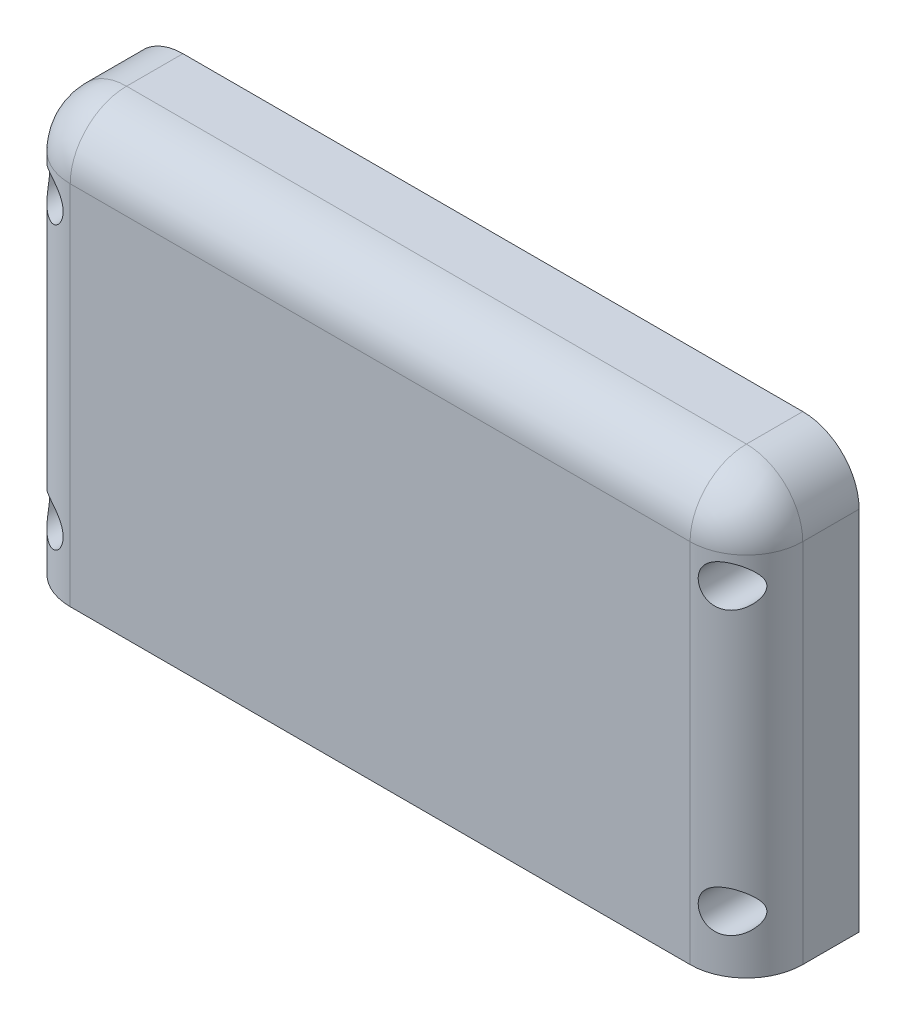
ISO-10303-21;
HEADER;
FILE_DESCRIPTION(('STEP AP214'),'2;1');
FILE_NAME('part.step','',(''),(''),'','','');
FILE_SCHEMA(('AUTOMOTIVE_DESIGN { 1 0 10303 214 1 1 1 1 }'));
ENDSEC;
DATA;
#1=APPLICATION_CONTEXT('core data for automotive mechanical design processes');
#2=APPLICATION_PROTOCOL_DEFINITION('international standard','automotive_design',2000,#1);
#3=PRODUCT_CONTEXT('',#1,'mechanical');
#4=PRODUCT('Part','Part','',(#3));
#5=PRODUCT_RELATED_PRODUCT_CATEGORY('part','',(#4));
#6=PRODUCT_DEFINITION_FORMATION('','',#4);
#7=PRODUCT_DEFINITION_CONTEXT('part definition',#1,'design');
#8=PRODUCT_DEFINITION('design','',#6,#7);
#9=PRODUCT_DEFINITION_SHAPE('','',#8);
#10=(LENGTH_UNIT() NAMED_UNIT(*) SI_UNIT(.MILLI.,.METRE.));
#11=(NAMED_UNIT(*) PLANE_ANGLE_UNIT() SI_UNIT($,.RADIAN.));
#12=(NAMED_UNIT(*) SI_UNIT($,.STERADIAN.) SOLID_ANGLE_UNIT());
#13=UNCERTAINTY_MEASURE_WITH_UNIT(LENGTH_MEASURE(1.E-05),#10,'distance_accuracy_value','');
#14=(GEOMETRIC_REPRESENTATION_CONTEXT(3) GLOBAL_UNCERTAINTY_ASSIGNED_CONTEXT((#13)) GLOBAL_UNIT_ASSIGNED_CONTEXT((#10,
#11,#12)) REPRESENTATION_CONTEXT('',''));
#15=CARTESIAN_POINT('',(0.,0.,0.));
#16=DIRECTION('',(0.,0.,1.));
#17=DIRECTION('',(1.,0.,0.));
#18=AXIS2_PLACEMENT_3D('',#15,#16,#17);
#19=CARTESIAN_POINT('',(0.,0.,5.08));
#20=DIRECTION('',(1.,0.,0.));
#21=DIRECTION('',(0.,0.,-1.));
#22=AXIS2_PLACEMENT_3D('',#19,#20,#21);
#23=PLANE('',#22);
#24=DIRECTION('',(0.,-1.,0.));
#25=VECTOR('',#24,1.);
#26=CARTESIAN_POINT('',(0.,0.,2.54));
#27=LINE('',#26,#25);
#28=CARTESIAN_POINT('',(0.,0.,2.54));
#29=VERTEX_POINT('',#28);
#30=CARTESIAN_POINT('',(0.,16.51,2.54));
#31=VERTEX_POINT('',#30);
#32=EDGE_CURVE('E172',#29,#31,#27,.F.);
#33=ORIENTED_EDGE('',*,*,#32,.T.);
#34=DIRECTION('',(0.,0.,-1.));
#35=VECTOR('',#34,1.);
#36=CARTESIAN_POINT('',(0.,16.51,5.08));
#37=LINE('',#36,#35);
#38=CARTESIAN_POINT('',(0.,16.51,0.));
#39=VERTEX_POINT('',#38);
#40=EDGE_CURVE('E128',#31,#39,#37,.T.);
#41=ORIENTED_EDGE('',*,*,#40,.T.);
#42=DIRECTION('',(0.,-1.,0.));
#43=VECTOR('',#42,1.);
#44=CARTESIAN_POINT('',(0.,0.,0.));
#45=LINE('',#44,#43);
#46=CARTESIAN_POINT('',(0.,0.,0.));
#47=VERTEX_POINT('',#46);
#48=EDGE_CURVE('E126',#39,#47,#45,.T.);
#49=ORIENTED_EDGE('',*,*,#48,.T.);
#50=DIRECTION('',(0.,0.,-1.));
#51=VECTOR('',#50,1.);
#52=CARTESIAN_POINT('',(0.,0.,5.08));
#53=LINE('',#52,#51);
#54=EDGE_CURVE('E110',#29,#47,#53,.T.);
#55=ORIENTED_EDGE('',*,*,#54,.F.);
#56=EDGE_LOOP('',(#33,#41,#49,#55));
#57=FACE_BOUND('',#56,.T.);
#58=ADVANCED_FACE('F39',(#57),#23,.F.);
#59=CARTESIAN_POINT('',(0.,0.,5.08));
#60=DIRECTION('',(0.,1.,0.));
#61=DIRECTION('',(0.,0.,1.));
#62=AXIS2_PLACEMENT_3D('',#59,#60,#61);
#63=PLANE('',#62);
#64=DIRECTION('',(0.,0.,-1.));
#65=VECTOR('',#64,1.);
#66=CARTESIAN_POINT('',(33.02,0.,5.08));
#67=LINE('',#66,#65);
#68=CARTESIAN_POINT('',(33.02,0.,2.54));
#69=VERTEX_POINT('',#68);
#70=CARTESIAN_POINT('',(33.02,0.,0.));
#71=VERTEX_POINT('',#70);
#72=EDGE_CURVE('E123',#69,#71,#67,.T.);
#73=ORIENTED_EDGE('',*,*,#72,.F.);
#74=CARTESIAN_POINT('',(30.48,0.,2.54));
#75=DIRECTION('',(0.,1.,0.));
#76=DIRECTION('',(0.,0.,1.));
#77=AXIS2_PLACEMENT_3D('',#74,#75,#76);
#78=CIRCLE('',#77,2.54);
#79=CARTESIAN_POINT('',(30.48,0.,5.08));
#80=VERTEX_POINT('',#79);
#81=EDGE_CURVE('E11',#69,#80,#78,.F.);
#82=ORIENTED_EDGE('',*,*,#81,.T.);
#83=DIRECTION('',(1.,0.,0.));
#84=VECTOR('',#83,1.);
#85=CARTESIAN_POINT('',(0.,0.,5.08));
#86=LINE('',#85,#84);
#87=CARTESIAN_POINT('',(2.54,0.,5.08));
#88=VERTEX_POINT('',#87);
#89=EDGE_CURVE('E148',#88,#80,#86,.T.);
#90=ORIENTED_EDGE('',*,*,#89,.F.);
#91=CARTESIAN_POINT('',(2.54,0.,2.54));
#92=DIRECTION('',(0.,1.,0.));
#93=DIRECTION('',(0.,0.,1.));
#94=AXIS2_PLACEMENT_3D('',#91,#92,#93);
#95=CIRCLE('',#94,2.54);
#96=EDGE_CURVE('E54',#88,#29,#95,.F.);
#97=ORIENTED_EDGE('',*,*,#96,.T.);
#98=ORIENTED_EDGE('',*,*,#54,.T.);
#99=DIRECTION('',(1.,0.,0.));
#100=VECTOR('',#99,1.);
#101=CARTESIAN_POINT('',(0.,0.,0.));
#102=LINE('',#101,#100);
#103=EDGE_CURVE('E115',#47,#71,#102,.T.);
#104=ORIENTED_EDGE('',*,*,#103,.T.);
#105=EDGE_LOOP('',(#73,#82,#90,#97,#98,#104));
#106=FACE_BOUND('',#105,.T.);
#107=ADVANCED_FACE('F113',(#106),#63,.F.);
#108=CARTESIAN_POINT('',(33.02,0.,5.08));
#109=DIRECTION('',(-1.,0.,0.));
#110=DIRECTION('',(0.,0.,1.));
#111=AXIS2_PLACEMENT_3D('',#108,#109,#110);
#112=PLANE('',#111);
#113=DIRECTION('',(0.,1.,0.));
#114=VECTOR('',#113,1.);
#115=CARTESIAN_POINT('',(33.02,0.,0.));
#116=LINE('',#115,#114);
#117=CARTESIAN_POINT('',(33.02,16.51,0.));
#118=VERTEX_POINT('',#117);
#119=EDGE_CURVE('E137',#71,#118,#116,.T.);
#120=ORIENTED_EDGE('',*,*,#119,.T.);
#121=DIRECTION('',(0.,0.,-1.));
#122=VECTOR('',#121,1.);
#123=CARTESIAN_POINT('',(33.02,16.51,5.08));
#124=LINE('',#123,#122);
#125=CARTESIAN_POINT('',(33.02,16.51,2.54));
#126=VERTEX_POINT('',#125);
#127=EDGE_CURVE('E169',#118,#126,#124,.F.);
#128=ORIENTED_EDGE('',*,*,#127,.T.);
#129=DIRECTION('',(0.,1.,0.));
#130=VECTOR('',#129,1.);
#131=CARTESIAN_POINT('',(33.02,0.,2.54));
#132=LINE('',#131,#130);
#133=EDGE_CURVE('E166',#126,#69,#132,.F.);
#134=ORIENTED_EDGE('',*,*,#133,.T.);
#135=ORIENTED_EDGE('',*,*,#72,.T.);
#136=EDGE_LOOP('',(#120,#128,#134,#135));
#137=FACE_BOUND('',#136,.T.);
#138=ADVANCED_FACE('F246',(#137),#112,.F.);
#139=CARTESIAN_POINT('',(0.,19.05,5.08));
#140=DIRECTION('',(0.,-1.,0.));
#141=DIRECTION('',(0.,0.,-1.));
#142=AXIS2_PLACEMENT_3D('',#139,#140,#141);
#143=PLANE('',#142);
#144=DIRECTION('',(-1.,0.,0.));
#145=VECTOR('',#144,1.);
#146=CARTESIAN_POINT('',(0.,19.05,2.54));
#147=LINE('',#146,#145);
#148=CARTESIAN_POINT('',(2.54,19.05,2.54));
#149=VERTEX_POINT('',#148);
#150=CARTESIAN_POINT('',(30.48,19.05,2.54));
#151=VERTEX_POINT('',#150);
#152=EDGE_CURVE('E122',#149,#151,#147,.F.);
#153=ORIENTED_EDGE('',*,*,#152,.T.);
#154=DIRECTION('',(0.,0.,-1.));
#155=VECTOR('',#154,1.);
#156=CARTESIAN_POINT('',(30.48,19.05,5.08));
#157=LINE('',#156,#155);
#158=CARTESIAN_POINT('',(30.48,19.05,0.));
#159=VERTEX_POINT('',#158);
#160=EDGE_CURVE('E156',#151,#159,#157,.T.);
#161=ORIENTED_EDGE('',*,*,#160,.T.);
#162=DIRECTION('',(-1.,0.,0.));
#163=VECTOR('',#162,1.);
#164=CARTESIAN_POINT('',(0.,19.05,0.));
#165=LINE('',#164,#163);
#166=CARTESIAN_POINT('',(2.54,19.05,0.));
#167=VERTEX_POINT('',#166);
#168=EDGE_CURVE('E141',#159,#167,#165,.T.);
#169=ORIENTED_EDGE('',*,*,#168,.T.);
#170=DIRECTION('',(0.,0.,-1.));
#171=VECTOR('',#170,1.);
#172=CARTESIAN_POINT('',(2.54,19.05,5.08));
#173=LINE('',#172,#171);
#174=EDGE_CURVE('E153',#167,#149,#173,.F.);
#175=ORIENTED_EDGE('',*,*,#174,.T.);
#176=EDGE_LOOP('',(#153,#161,#169,#175));
#177=FACE_BOUND('',#176,.T.);
#178=ADVANCED_FACE('F240',(#177),#143,.F.);
#179=CARTESIAN_POINT('',(0.,0.,5.08));
#180=DIRECTION('',(0.,0.,-1.));
#181=DIRECTION('',(-1.,0.,0.));
#182=AXIS2_PLACEMENT_3D('',#179,#180,#181);
#183=PLANE('',#182);
#184=ORIENTED_EDGE('',*,*,#89,.T.);
#185=DIRECTION('',(0.,1.,0.));
#186=VECTOR('',#185,1.);
#187=CARTESIAN_POINT('',(30.48,0.,5.08));
#188=LINE('',#187,#186);
#189=CARTESIAN_POINT('',(30.48,16.51,5.08));
#190=VERTEX_POINT('',#189);
#191=EDGE_CURVE('E62',#80,#190,#188,.T.);
#192=ORIENTED_EDGE('',*,*,#191,.T.);
#193=DIRECTION('',(-1.,0.,0.));
#194=VECTOR('',#193,1.);
#195=CARTESIAN_POINT('',(0.,16.51,5.08));
#196=LINE('',#195,#194);
#197=CARTESIAN_POINT('',(2.54,16.51,5.08));
#198=VERTEX_POINT('',#197);
#199=EDGE_CURVE('E66',#190,#198,#196,.T.);
#200=ORIENTED_EDGE('',*,*,#199,.T.);
#201=DIRECTION('',(0.,-1.,0.));
#202=VECTOR('',#201,1.);
#203=CARTESIAN_POINT('',(2.54,0.,5.08));
#204=LINE('',#203,#202);
#205=EDGE_CURVE('E177',#198,#88,#204,.T.);
#206=ORIENTED_EDGE('',*,*,#205,.T.);
#207=EDGE_LOOP('',(#184,#192,#200,#206));
#208=FACE_BOUND('',#207,.T.);
#209=ADVANCED_FACE('F237',(#208),#183,.F.);
#210=CARTESIAN_POINT('',(0.,0.,0.));
#211=DIRECTION('',(0.,0.,-1.));
#212=DIRECTION('',(-1.,0.,0.));
#213=AXIS2_PLACEMENT_3D('',#210,#211,#212);
#214=PLANE('',#213);
#215=CARTESIAN_POINT('',(1.27,15.24,0.));
#216=DIRECTION('',(0.,0.,1.));
#217=DIRECTION('',(1.,0.,0.));
#218=AXIS2_PLACEMENT_3D('',#215,#216,#217);
#219=CIRCLE('',#218,0.927099999999988);
#220=CARTESIAN_POINT('',(2.19709999999999,15.24,0.));
#221=VERTEX_POINT('',#220);
#222=EDGE_CURVE('E293',#221,#221,#219,.T.);
#223=ORIENTED_EDGE('',*,*,#222,.T.);
#224=EDGE_LOOP('',(#223));
#225=FACE_BOUND('',#224,.T.);
#226=CARTESIAN_POINT('',(1.27,2.54,0.));
#227=DIRECTION('',(0.,0.,1.));
#228=DIRECTION('',(1.,0.,0.));
#229=AXIS2_PLACEMENT_3D('',#226,#227,#228);
#230=CIRCLE('',#229,0.927099999999988);
#231=CARTESIAN_POINT('',(2.19709999999999,2.54,0.));
#232=VERTEX_POINT('',#231);
#233=EDGE_CURVE('E288',#232,#232,#230,.T.);
#234=ORIENTED_EDGE('',*,*,#233,.T.);
#235=EDGE_LOOP('',(#234));
#236=FACE_BOUND('',#235,.T.);
#237=CARTESIAN_POINT('',(31.75,15.24,0.));
#238=DIRECTION('',(0.,0.,1.));
#239=DIRECTION('',(1.,0.,0.));
#240=AXIS2_PLACEMENT_3D('',#237,#238,#239);
#241=CIRCLE('',#240,0.927099999999986);
#242=CARTESIAN_POINT('',(32.6771,15.24,0.));
#243=VERTEX_POINT('',#242);
#244=EDGE_CURVE('E219',#243,#243,#241,.T.);
#245=ORIENTED_EDGE('',*,*,#244,.T.);
#246=EDGE_LOOP('',(#245));
#247=FACE_BOUND('',#246,.T.);
#248=CARTESIAN_POINT('',(31.75,2.54,0.));
#249=DIRECTION('',(0.,0.,1.));
#250=DIRECTION('',(1.,0.,0.));
#251=AXIS2_PLACEMENT_3D('',#248,#249,#250);
#252=CIRCLE('',#251,0.927099999999986);
#253=CARTESIAN_POINT('',(32.6771,2.54,0.));
#254=VERTEX_POINT('',#253);
#255=EDGE_CURVE('E132',#254,#254,#252,.T.);
#256=ORIENTED_EDGE('',*,*,#255,.T.);
#257=EDGE_LOOP('',(#256));
#258=FACE_BOUND('',#257,.T.);
#259=ORIENTED_EDGE('',*,*,#168,.F.);
#260=CARTESIAN_POINT('',(30.48,16.51,0.));
#261=DIRECTION('',(0.,0.,-1.));
#262=DIRECTION('',(-1.,0.,0.));
#263=AXIS2_PLACEMENT_3D('',#260,#261,#262);
#264=CIRCLE('',#263,2.54);
#265=EDGE_CURVE('E163',#159,#118,#264,.T.);
#266=ORIENTED_EDGE('',*,*,#265,.T.);
#267=ORIENTED_EDGE('',*,*,#119,.F.);
#268=ORIENTED_EDGE('',*,*,#103,.F.);
#269=ORIENTED_EDGE('',*,*,#48,.F.);
#270=CARTESIAN_POINT('',(2.54,16.51,0.));
#271=DIRECTION('',(0.,0.,-1.));
#272=DIRECTION('',(-1.,0.,0.));
#273=AXIS2_PLACEMENT_3D('',#270,#271,#272);
#274=CIRCLE('',#273,2.54);
#275=EDGE_CURVE('E160',#39,#167,#274,.T.);
#276=ORIENTED_EDGE('',*,*,#275,.T.);
#277=EDGE_LOOP('',(#259,#266,#267,#268,#269,#276));
#278=FACE_BOUND('',#277,.T.);
#279=ADVANCED_FACE('F135',(#225,#236,#247,#258,#278),#214,.T.);
#280=CARTESIAN_POINT('',(31.75,2.54,5.08));
#281=DIRECTION('',(0.,0.,1.));
#282=DIRECTION('',(1.,0.,0.));
#283=AXIS2_PLACEMENT_3D('',#280,#281,#282);
#284=CYLINDRICAL_SURFACE('',#283,0.927099999999986);
#285=ORIENTED_EDGE('',*,*,#255,.F.);
#286=EDGE_LOOP('',(#285));
#287=FACE_BOUND('',#286,.T.);
#288=CARTESIAN_POINT('',(30.8229,2.54,5.05674782010436));
#289=CARTESIAN_POINT('',(30.8229012107151,2.48857622692679,5.05674842085022));
#290=CARTESIAN_POINT('',(30.8271907938908,2.43713827577921,5.05617458287029));
#291=CARTESIAN_POINT('',(30.8442288339278,2.33569488999086,5.05376399726779));
#292=CARTESIAN_POINT('',(30.8569812236406,2.28569013266297,5.05192666245618));
#293=CARTESIAN_POINT('',(30.8905623765174,2.18854241491566,5.04665631256686));
#294=CARTESIAN_POINT('',(30.9113928412749,2.14140005986379,5.04322296126849));
#295=CARTESIAN_POINT('',(30.9604579646784,2.05136387109352,5.03426922093524));
#296=CARTESIAN_POINT('',(30.9886912392668,2.00846924526648,5.0287492219429));
#297=CARTESIAN_POINT('',(31.0513378745247,1.92848971201818,5.01511391445401));
#298=CARTESIAN_POINT('',(31.0856998252567,1.89136094674488,5.00701978739397));
#299=CARTESIAN_POINT('',(31.1595012425582,1.8235246697393,4.98771908914667));
#300=CARTESIAN_POINT('',(31.1989398603383,1.79281608683674,4.97651303789354));
#301=CARTESIAN_POINT('',(31.2809659326113,1.73880872777845,4.95078380206203));
#302=CARTESIAN_POINT('',(31.3235150829412,1.71543401973978,4.93629747954914));
#303=CARTESIAN_POINT('',(31.4105903566023,1.67593838260031,4.90384431365518));
#304=CARTESIAN_POINT('',(31.4551166192169,1.65981796544205,4.88587722476092));
#305=CARTESIAN_POINT('',(31.5461387476219,1.63431704408319,4.84596960938587));
#306=CARTESIAN_POINT('',(31.5926516850013,1.62517184978106,4.8239191995525));
#307=CARTESIAN_POINT('',(31.6848950547054,1.6140206668189,4.77663133264621));
#308=CARTESIAN_POINT('',(31.7306250863893,1.6120182307316,4.75139229611496));
#309=CARTESIAN_POINT('',(31.8255395618517,1.61462513149639,4.69511269216502));
#310=CARTESIAN_POINT('',(31.8745022814407,1.62003535159659,4.66373884125301));
#311=CARTESIAN_POINT('',(31.9692586642101,1.63790920027172,4.5984044860878));
#312=CARTESIAN_POINT('',(32.0150519332495,1.65037370432847,4.56444366122737));
#313=CARTESIAN_POINT('',(32.1114908878299,1.68446620750609,4.48790101697841));
#314=CARTESIAN_POINT('',(32.1613598279764,1.7074010095044,4.44492298618089));
#315=CARTESIAN_POINT('',(32.2555292279242,1.7609625130335,4.35748459055956));
#316=CARTESIAN_POINT('',(32.2998137950274,1.79161045562256,4.31302043127481));
#317=CARTESIAN_POINT('',(32.3910006853179,1.86707141382439,4.2148145795956));
#318=CARTESIAN_POINT('',(32.4365702206236,1.91350114085218,4.1610444264696));
#319=CARTESIAN_POINT('',(32.4978466571707,1.9910783777556,4.08304834775508));
#320=CARTESIAN_POINT('',(32.5170723668173,2.01821972764007,4.05752385974812));
#321=CARTESIAN_POINT('',(32.5530080381441,2.07542072166705,4.0080479600548));
#322=CARTESIAN_POINT('',(32.5697213108408,2.10547643758407,3.98409450188904));
#323=CARTESIAN_POINT('',(32.597661600557,2.16339526859636,3.94271958977508));
#324=CARTESIAN_POINT('',(32.6093376554653,2.19074176991488,3.92488423447062));
#325=CARTESIAN_POINT('',(32.630408396975,2.2478992701303,3.89193394338652));
#326=CARTESIAN_POINT('',(32.6398029501272,2.27771041305191,3.87681916675184));
#327=CARTESIAN_POINT('',(32.6559236651209,2.34031150504431,3.85041992585826));
#328=CARTESIAN_POINT('',(32.6626064792788,2.37314027614036,3.83919807143984));
#329=CARTESIAN_POINT('',(32.6723956278624,2.44073009913979,3.82261457090186));
#330=CARTESIAN_POINT('',(32.6755141073494,2.47548416375552,3.81723302777743));
#331=CARTESIAN_POINT('',(32.6775899431359,2.54059065907881,3.81365648525021));
#332=CARTESIAN_POINT('',(32.6770692186025,2.57087735328561,3.81456001168867));
#333=CARTESIAN_POINT('',(32.6731395610436,2.63071671550679,3.82130909057787));
#334=CARTESIAN_POINT('',(32.6697265697805,2.66026829204953,3.82716158707179));
#335=CARTESIAN_POINT('',(32.6594642425513,2.72329475209744,3.84447371992831));
#336=CARTESIAN_POINT('',(32.6520825397158,2.75643906800865,3.85679165985279));
#337=CARTESIAN_POINT('',(32.6344072598412,2.82006053658124,3.88551674164698));
#338=CARTESIAN_POINT('',(32.6241069894692,2.85053134506665,3.90193327266106));
#339=CARTESIAN_POINT('',(32.5934229579132,2.92846649472867,3.94935286132089));
#340=CARTESIAN_POINT('',(32.5709110399508,2.97361261787719,3.98275156237977));
#341=CARTESIAN_POINT('',(32.5206054906149,3.05777204123907,4.05308525775388));
#342=CARTESIAN_POINT('',(32.4927966158103,3.09676703281045,4.09003030156164));
#343=CARTESIAN_POINT('',(32.4192766586239,3.18512056910564,4.18182626761309));
#344=CARTESIAN_POINT('',(32.3710455926724,3.23158847122756,4.23746325100069));
#345=CARTESIAN_POINT('',(32.2654967212139,3.31344710158849,4.34816602111332));
#346=CARTESIAN_POINT('',(32.208184851669,3.34884502143991,4.40323215611132));
#347=CARTESIAN_POINT('',(32.0959766805038,3.40194267152513,4.5007962878181));
#348=CARTESIAN_POINT('',(32.0424724991765,3.42167288861306,4.54378426017936));
#349=CARTESIAN_POINT('',(31.9303599297786,3.45122620703006,4.62635520236587));
#350=CARTESIAN_POINT('',(31.8717599733111,3.46106534783007,4.6659435893197));
#351=CARTESIAN_POINT('',(31.7618090906881,3.46835027795009,4.73361557850565));
#352=CARTESIAN_POINT('',(31.7110719235011,3.46772073520825,4.76248336396284));
#353=CARTESIAN_POINT('',(31.6083839875513,3.45766851310357,4.81633512655879));
#354=CARTESIAN_POINT('',(31.5564337167599,3.44824938203089,4.8413206661831));
#355=CARTESIAN_POINT('',(31.4528258651063,3.41983102985462,4.88700540669775));
#356=CARTESIAN_POINT('',(31.4011719942336,3.40077380745528,4.90767757329472));
#357=CARTESIAN_POINT('',(31.3007890752861,3.35290224099055,4.94432113244824));
#358=CARTESIAN_POINT('',(31.2520587185152,3.32409230162816,4.96029464102393));
#359=CARTESIAN_POINT('',(31.1648455945986,3.26089850715132,4.98631136432757));
#360=CARTESIAN_POINT('',(31.1258242228831,3.22743912280962,4.99680585771543));
#361=CARTESIAN_POINT('',(31.0535359037548,3.15408612288179,5.0146808232198));
#362=CARTESIAN_POINT('',(31.0202685179158,3.11419299796396,5.02206153265353));
#363=CARTESIAN_POINT('',(30.961722562275,3.03056488230424,5.03407502030778));
#364=CARTESIAN_POINT('',(30.9362159441536,2.98700083923981,5.03879069467277));
#365=CARTESIAN_POINT('',(30.8925758287135,2.89619322384919,5.04636673156348));
#366=CARTESIAN_POINT('',(30.8744392292285,2.84895120964208,5.04922787499524));
#367=CARTESIAN_POINT('',(30.8478961389393,2.75831269485183,5.05324646127377));
#368=CARTESIAN_POINT('',(30.8385411976129,2.71519821954318,5.05457512882198));
#369=CARTESIAN_POINT('',(30.8260424717124,2.62805932186184,5.0563255711814));
#370=CARTESIAN_POINT('',(30.8228989632486,2.58403485912632,5.05674730567771));
#371=CARTESIAN_POINT('',(30.8229,2.54,5.05674782010436));
#372=B_SPLINE_CURVE_WITH_KNOTS('',3,(#288,#289,#290,#291,#292,#293,#294,#295,#296,#297,#298,
#299,#300,#301,#302,#303,#304,#305,#306,#307,#308,#309,#310,#311,#312,#313,#314,#315,#316,#317,
#318,#319,#320,#321,#322,#323,#324,#325,#326,#327,#328,#329,#330,#331,#332,#333,#334,#335,#336,
#337,#338,#339,#340,#341,#342,#343,#344,#345,#346,#347,#348,#349,#350,#351,#352,#353,#354,#355,
#356,#357,#358,#359,#360,#361,#362,#363,#364,#365,#366,#367,#368,#369,#370,#371),.UNSPECIFIED.,
.T.,.F.,(4,2,2,2,2,2,2,2,2,2,2,2,2,2,2,2,2,2,2,2,2,2,2,2,2,2,2,2,2,2,2,2,2,2,2,2,2,2,2,2,2,4),
(0.,0.154115044817334,0.308301760472588,0.462520972201676,0.616711371049356,0.769664473160788,
0.922592035530822,1.07387958617095,1.22517781165063,1.38137837464219,1.53765661582613,
1.71221708187197,1.88679921674209,2.09517770831034,2.30413645148638,2.55604410575779,
2.68167636182427,2.80714157388309,2.91095648876066,3.01477747449923,3.12019823165962,
3.22525869868207,3.31559522901872,3.40605872388287,3.51382342298813,3.62183729420488,
3.80233602562292,3.98336226101798,4.24328805322043,4.50304463219025,4.71647478554706,
4.92955827735796,5.10398165327327,5.27833464624154,5.45374959418205,5.6290854234328,
5.78568696266354,5.9422765643428,6.09368124810405,6.24502213688072,6.37698702844759,
6.50895778598256),.UNSPECIFIED.);
#373=CARTESIAN_POINT('',(30.8229,2.54,5.05674782010436));
#374=VERTEX_POINT('',#373);
#375=EDGE_CURVE('E210',#374,#374,#372,.T.);
#376=ORIENTED_EDGE('',*,*,#375,.T.);
#377=EDGE_LOOP('',(#376));
#378=FACE_BOUND('',#377,.T.);
#379=ADVANCED_FACE('F229',(#287,#378),#284,.F.);
#380=CARTESIAN_POINT('',(31.75,15.24,5.08));
#381=DIRECTION('',(0.,0.,1.));
#382=DIRECTION('',(1.,0.,0.));
#383=AXIS2_PLACEMENT_3D('',#380,#381,#382);
#384=CYLINDRICAL_SURFACE('',#383,0.927099999999986);
#385=ORIENTED_EDGE('',*,*,#244,.F.);
#386=EDGE_LOOP('',(#385));
#387=FACE_BOUND('',#386,.T.);
#388=CARTESIAN_POINT('',(30.8229,15.24,5.05674782010436));
#389=CARTESIAN_POINT('',(30.8229012107151,15.1885762269268,5.05674842085022));
#390=CARTESIAN_POINT('',(30.8271907938908,15.1371382757792,5.05617458287029));
#391=CARTESIAN_POINT('',(30.8442288339278,15.0356948899909,5.05376399726779));
#392=CARTESIAN_POINT('',(30.8569812236406,14.985690132663,5.05192666245618));
#393=CARTESIAN_POINT('',(30.8905623765174,14.8885424149157,5.04665631256686));
#394=CARTESIAN_POINT('',(30.9113928412749,14.8414000598638,5.04322296126849));
#395=CARTESIAN_POINT('',(30.9604579646784,14.7513638710935,5.03426922093524));
#396=CARTESIAN_POINT('',(30.9886912392668,14.7084692452665,5.0287492219429));
#397=CARTESIAN_POINT('',(31.0513378745247,14.6284897120182,5.01511391445401));
#398=CARTESIAN_POINT('',(31.0856998252567,14.5913609467449,5.00701978739397));
#399=CARTESIAN_POINT('',(31.1595012425582,14.5235246697393,4.98771908914667));
#400=CARTESIAN_POINT('',(31.1989398603383,14.4928160868367,4.97651303789354));
#401=CARTESIAN_POINT('',(31.2809659326113,14.4388087277785,4.95078380206203));
#402=CARTESIAN_POINT('',(31.3235150829412,14.4154340197398,4.93629747954914));
#403=CARTESIAN_POINT('',(31.4105903566023,14.3759383826003,4.90384431365519));
#404=CARTESIAN_POINT('',(31.4551166192169,14.3598179654421,4.88587722476092));
#405=CARTESIAN_POINT('',(31.5461387476219,14.3343170440832,4.84596960938587));
#406=CARTESIAN_POINT('',(31.5926516850013,14.3251718497811,4.8239191995525));
#407=CARTESIAN_POINT('',(31.6848950547054,14.3140206668189,4.77663133264621));
#408=CARTESIAN_POINT('',(31.7306250863893,14.3120182307316,4.75139229611496));
#409=CARTESIAN_POINT('',(31.8255395618517,14.3146251314964,4.69511269216502));
#410=CARTESIAN_POINT('',(31.8745022814407,14.3200353515966,4.66373884125301));
#411=CARTESIAN_POINT('',(31.9692586642101,14.3379092002717,4.5984044860878));
#412=CARTESIAN_POINT('',(32.0150519332495,14.3503737043285,4.56444366122737));
#413=CARTESIAN_POINT('',(32.1114908878299,14.3844662075061,4.48790101697841));
#414=CARTESIAN_POINT('',(32.1613598279764,14.4074010095044,4.44492298618089));
#415=CARTESIAN_POINT('',(32.2555292279242,14.4609625130335,4.35748459055956));
#416=CARTESIAN_POINT('',(32.2998137950274,14.4916104556226,4.31302043127481));
#417=CARTESIAN_POINT('',(32.3910006853179,14.5670714138244,4.2148145795956));
#418=CARTESIAN_POINT('',(32.4365702206236,14.6135011408522,4.1610444264696));
#419=CARTESIAN_POINT('',(32.4978466571707,14.6910783777556,4.08304834775508));
#420=CARTESIAN_POINT('',(32.5170723668173,14.7182197276401,4.05752385974812));
#421=CARTESIAN_POINT('',(32.5530080381441,14.7754207216671,4.0080479600548));
#422=CARTESIAN_POINT('',(32.5697213108408,14.8054764375841,3.98409450188904));
#423=CARTESIAN_POINT('',(32.597661600557,14.8633952685964,3.94271958977508));
#424=CARTESIAN_POINT('',(32.6093376554653,14.8907417699149,3.92488423447062));
#425=CARTESIAN_POINT('',(32.630408396975,14.9478992701303,3.89193394338652));
#426=CARTESIAN_POINT('',(32.6398029501272,14.9777104130519,3.87681916675184));
#427=CARTESIAN_POINT('',(32.6559236651209,15.0403115050443,3.85041992585826));
#428=CARTESIAN_POINT('',(32.6626064792788,15.0731402761404,3.83919807143984));
#429=CARTESIAN_POINT('',(32.6723956278624,15.1407300991398,3.82261457090186));
#430=CARTESIAN_POINT('',(32.6755141073494,15.1754841637555,3.81723302777743));
#431=CARTESIAN_POINT('',(32.6775899431359,15.2405906590788,3.81365648525021));
#432=CARTESIAN_POINT('',(32.6770692186025,15.2708773532856,3.81456001168867));
#433=CARTESIAN_POINT('',(32.6731395610436,15.3307167155068,3.82130909057787));
#434=CARTESIAN_POINT('',(32.6697265697805,15.3602682920495,3.82716158707179));
#435=CARTESIAN_POINT('',(32.6594642425513,15.4232947520974,3.84447371992831));
#436=CARTESIAN_POINT('',(32.6520825397158,15.4564390680087,3.85679165985279));
#437=CARTESIAN_POINT('',(32.6344072598412,15.5200605365812,3.88551674164698));
#438=CARTESIAN_POINT('',(32.6241069894692,15.5505313450667,3.90193327266106));
#439=CARTESIAN_POINT('',(32.5934229579132,15.6284664947287,3.94935286132089));
#440=CARTESIAN_POINT('',(32.5709110399508,15.6736126178772,3.98275156237977));
#441=CARTESIAN_POINT('',(32.5206054906149,15.7577720412391,4.05308525775388));
#442=CARTESIAN_POINT('',(32.4927966158103,15.7967670328105,4.09003030156164));
#443=CARTESIAN_POINT('',(32.4192766586239,15.8851205691056,4.18182626761309));
#444=CARTESIAN_POINT('',(32.3710455926724,15.9315884712276,4.23746325100069));
#445=CARTESIAN_POINT('',(32.2654967212139,16.0134471015885,4.34816602111332));
#446=CARTESIAN_POINT('',(32.208184851669,16.0488450214399,4.40323215611132));
#447=CARTESIAN_POINT('',(32.0959766805038,16.1019426715251,4.50079628781811));
#448=CARTESIAN_POINT('',(32.0424724991765,16.1216728886131,4.54378426017936));
#449=CARTESIAN_POINT('',(31.9303599297786,16.1512262070301,4.62635520236586));
#450=CARTESIAN_POINT('',(31.8717599733111,16.1610653478301,4.6659435893197));
#451=CARTESIAN_POINT('',(31.7618090906881,16.1683502779501,4.73361557850564));
#452=CARTESIAN_POINT('',(31.7110719235011,16.1677207352083,4.76248336396284));
#453=CARTESIAN_POINT('',(31.6083839875514,16.1576685131036,4.81633512655878));
#454=CARTESIAN_POINT('',(31.5564337167599,16.1482493820309,4.84132066618309));
#455=CARTESIAN_POINT('',(31.4528258651063,16.1198310298546,4.88700540669774));
#456=CARTESIAN_POINT('',(31.4011719942337,16.1007738074553,4.90767757329471));
#457=CARTESIAN_POINT('',(31.3007890752861,16.0529022409906,4.94432113244824));
#458=CARTESIAN_POINT('',(31.2520587185152,16.0240923016282,4.96029464102393));
#459=CARTESIAN_POINT('',(31.1648455945986,15.9608985071513,4.98631136432757));
#460=CARTESIAN_POINT('',(31.1258242228831,15.9274391228096,4.99680585771543));
#461=CARTESIAN_POINT('',(31.0535359037548,15.8540861228818,5.0146808232198));
#462=CARTESIAN_POINT('',(31.0202685179158,15.814192997964,5.02206153265353));
#463=CARTESIAN_POINT('',(30.961722562275,15.7305648823042,5.03407502030778));
#464=CARTESIAN_POINT('',(30.9362159441536,15.6870008392398,5.03879069467277));
#465=CARTESIAN_POINT('',(30.8925758287135,15.5961932238492,5.04636673156348));
#466=CARTESIAN_POINT('',(30.8744392292285,15.5489512096421,5.04922787499524));
#467=CARTESIAN_POINT('',(30.8478961389393,15.4583126948518,5.05324646127377));
#468=CARTESIAN_POINT('',(30.8385411976129,15.4151982195432,5.05457512882198));
#469=CARTESIAN_POINT('',(30.8260424717124,15.3280593218618,5.05632557118139));
#470=CARTESIAN_POINT('',(30.8228989632486,15.2840348591263,5.05674730567771));
#471=CARTESIAN_POINT('',(30.8229,15.24,5.05674782010436));
#472=B_SPLINE_CURVE_WITH_KNOTS('',3,(#388,#389,#390,#391,#392,#393,#394,#395,#396,#397,#398,
#399,#400,#401,#402,#403,#404,#405,#406,#407,#408,#409,#410,#411,#412,#413,#414,#415,#416,#417,
#418,#419,#420,#421,#422,#423,#424,#425,#426,#427,#428,#429,#430,#431,#432,#433,#434,#435,#436,
#437,#438,#439,#440,#441,#442,#443,#444,#445,#446,#447,#448,#449,#450,#451,#452,#453,#454,#455,
#456,#457,#458,#459,#460,#461,#462,#463,#464,#465,#466,#467,#468,#469,#470,#471),.UNSPECIFIED.,
.T.,.F.,(4,2,2,2,2,2,2,2,2,2,2,2,2,2,2,2,2,2,2,2,2,2,2,2,2,2,2,2,2,2,2,2,2,2,2,2,2,2,2,2,2,4),
(0.,0.154115044817335,0.308301760472588,0.462520972201676,0.616711371049356,0.769664473160788,
0.922592035530823,1.07387958617095,1.22517781165063,1.38137837464219,1.53765661582613,
1.71221708187197,1.88679921674209,2.09517770831034,2.30413645148638,2.55604410575779,
2.68167636182427,2.80714157388309,2.91095648876067,3.01477747449923,3.12019823165963,
3.22525869868207,3.31559522901872,3.40605872388288,3.51382342298813,3.62183729420488,
3.80233602562292,3.98336226101798,4.24328805322043,4.50304463219025,4.71647478554706,
4.92955827735796,5.10398165327326,5.27833464624153,5.45374959418203,5.62908542343279,
5.78568696266353,5.9422765643428,6.09368124810404,6.24502213688071,6.37698702844759,
6.50895778598256),.UNSPECIFIED.);
#473=CARTESIAN_POINT('',(30.8229,15.24,5.05674782010436));
#474=VERTEX_POINT('',#473);
#475=EDGE_CURVE('E220',#474,#474,#472,.T.);
#476=ORIENTED_EDGE('',*,*,#475,.T.);
#477=EDGE_LOOP('',(#476));
#478=FACE_BOUND('',#477,.T.);
#479=ADVANCED_FACE('F233',(#387,#478),#384,.F.);
#480=CARTESIAN_POINT('',(1.27,2.54,5.08));
#481=DIRECTION('',(0.,0.,1.));
#482=DIRECTION('',(1.,0.,0.));
#483=AXIS2_PLACEMENT_3D('',#480,#481,#482);
#484=CYLINDRICAL_SURFACE('',#483,0.927099999999988);
#485=ORIENTED_EDGE('',*,*,#233,.F.);
#486=EDGE_LOOP('',(#485));
#487=FACE_BOUND('',#486,.T.);
#488=CARTESIAN_POINT('',(0.342900000000012,2.54,3.81450052569626));
#489=CARTESIAN_POINT('',(0.342903413704056,2.51099833145569,3.81450797588072));
#490=CARTESIAN_POINT('',(0.344277391925884,2.48196376789671,3.81688410241569));
#491=CARTESIAN_POINT('',(0.349631655224006,2.42481420447787,3.82604510801862));
#492=CARTESIAN_POINT('',(0.353619540652749,2.3967021379966,3.83284284317762));
#493=CARTESIAN_POINT('',(0.365458737270826,2.33347247709388,3.85268398223955));
#494=CARTESIAN_POINT('',(0.374129319353401,2.29892176373449,3.86701734336025));
#495=CARTESIAN_POINT('',(0.394569560434638,2.2328538176602,3.89981772416955));
#496=CARTESIAN_POINT('',(0.406346696143964,2.20134415733993,3.91829470022609));
#497=CARTESIAN_POINT('',(0.441419929623838,2.12041972003629,3.97148314712375));
#498=CARTESIAN_POINT('',(0.467061328665768,2.07362883570177,4.00860797326605));
#499=CARTESIAN_POINT('',(0.524193631566747,1.98683870878606,4.08611658529572));
#500=CARTESIAN_POINT('',(0.555699990611453,1.94685795786633,4.12650881855616));
#501=CARTESIAN_POINT('',(0.635539805908158,1.86066791625084,4.22216942270545));
#502=CARTESIAN_POINT('',(0.68597196087766,1.81687124002268,4.27788096310446));
#503=CARTESIAN_POINT('',(0.795800751627057,1.74056096757447,4.38808618350014));
#504=CARTESIAN_POINT('',(0.855187475643875,1.70803502551954,4.44258113450255));
#505=CARTESIAN_POINT('',(0.969296962575168,1.66132347172804,4.53720094312241));
#506=CARTESIAN_POINT('',(1.02248982078853,1.64474747541475,4.57798544511345));
#507=CARTESIAN_POINT('',(1.13339325270131,1.62127571756521,4.65604154812078));
#508=CARTESIAN_POINT('',(1.19109699313131,1.61436560268685,4.69331828104949));
#509=CARTESIAN_POINT('',(1.29952843843209,1.61206470835458,4.75722769813736));
#510=CARTESIAN_POINT('',(1.34978330144179,1.61492180173441,4.78459398335694));
#511=CARTESIAN_POINT('',(1.45104950919014,1.62931571617274,4.8354277048061));
#512=CARTESIAN_POINT('',(1.50206054261479,1.64084905746745,4.85889669950807));
#513=CARTESIAN_POINT('',(1.60327564523601,1.67323681787602,4.90160572267157));
#514=CARTESIAN_POINT('',(1.65347380809788,1.69414164857489,4.9208220284772));
#515=CARTESIAN_POINT('',(1.75054848911622,1.74527214032599,4.95474871487646));
#516=CARTESIAN_POINT('',(1.79742608179096,1.77549476908883,4.96946055825668));
#517=CARTESIAN_POINT('',(1.88133824935209,1.8411863337367,4.99346445444358));
#518=CARTESIAN_POINT('',(1.91888657988606,1.87586120523465,5.00314398966395));
#519=CARTESIAN_POINT('',(1.98803074145391,1.95130413807362,5.01955537729409));
#520=CARTESIAN_POINT('',(2.01962739190759,1.99207135923957,5.02628763565045));
#521=CARTESIAN_POINT('',(2.07502985224546,2.07743369560883,5.03723521245428));
#522=CARTESIAN_POINT('',(2.09900914538322,2.12190908400059,5.04150870645124));
#523=CARTESIAN_POINT('',(2.13945974767114,2.21427571089771,5.04830420414509));
#524=CARTESIAN_POINT('',(2.15593082958305,2.26216705273719,5.05082615483222));
#525=CARTESIAN_POINT('',(2.18102766539338,2.3606697037502,5.05453844816871));
#526=CARTESIAN_POINT('',(2.18954987195752,2.41130805928932,5.05571126066997));
#527=CARTESIAN_POINT('',(2.19812832599208,2.51331202930654,5.05689149785352));
#528=CARTESIAN_POINT('',(2.19818400198205,2.56467769264299,5.05689884386825));
#529=CARTESIAN_POINT('',(2.18979118537307,2.66712983097156,5.05574476133995));
#530=CARTESIAN_POINT('',(2.18127179957769,2.71821040949624,5.05457358957713));
#531=CARTESIAN_POINT('',(2.15587818039951,2.81819904425018,5.05081931550854));
#532=CARTESIAN_POINT('',(2.13900387853842,2.86710708266935,5.04823620163023));
#533=CARTESIAN_POINT('',(2.09747456873556,2.96123677675098,5.0412419550587));
#534=CARTESIAN_POINT('',(2.07283633724748,3.00646611875014,5.03683475750534));
#535=CARTESIAN_POINT('',(2.01659014096271,3.09203043447164,5.02565097795977));
#536=CARTESIAN_POINT('',(1.98498323401499,3.13236614961021,5.01887475549557));
#537=CARTESIAN_POINT('',(1.91636507476262,3.2065178142677,5.00249959620947));
#538=CARTESIAN_POINT('',(1.87942686510689,3.24040944698746,4.99293726758045));
#539=CARTESIAN_POINT('',(1.80122646872905,3.30142762065521,4.97052757980488));
#540=CARTESIAN_POINT('',(1.75996492274002,3.32855516205603,4.95768070703362));
#541=CARTESIAN_POINT('',(1.67487311308933,3.37542839104472,4.9285488115326));
#542=CARTESIAN_POINT('',(1.63105682898408,3.39521055862677,4.91228142561032));
#543=CARTESIAN_POINT('',(1.54219397977463,3.42750314566948,4.87629665307008));
#544=CARTESIAN_POINT('',(1.49714719385207,3.44001225085506,4.85657864374596));
#545=CARTESIAN_POINT('',(1.40488928508988,3.45850165333024,4.81285283235572));
#546=CARTESIAN_POINT('',(1.35768530232974,3.46411530941223,4.78867720629879));
#547=CARTESIAN_POINT('',(1.26467232348351,3.46825475768881,4.73726408503233));
#548=CARTESIAN_POINT('',(1.21886398132782,3.46677727719278,4.7100251817281));
#549=CARTESIAN_POINT('',(1.12330775595815,3.45684979251239,4.64908103830617));
#550=CARTESIAN_POINT('',(1.07389752009366,3.44745901922808,4.61500328294057));
#551=CARTESIAN_POINT('',(0.978817584294472,3.42156615535543,4.54445086804204));
#552=CARTESIAN_POINT('',(0.933149936614379,3.40506019378531,4.50797491294863));
#553=CARTESIAN_POINT('',(0.836982715343112,3.36178890779513,4.42576565812111));
#554=CARTESIAN_POINT('',(0.787426876542327,3.33361031505376,4.37967371754927));
#555=CARTESIAN_POINT('',(0.694668316149851,3.26918155471964,4.28661698512994));
#556=CARTESIAN_POINT('',(0.651474780105861,3.23291990331591,4.23965103944372));
#557=CARTESIAN_POINT('',(0.575507844280374,3.15630504502574,4.15104203336136));
#558=CARTESIAN_POINT('',(0.542139658760922,3.11664279359558,4.10930915270041));
#559=CARTESIAN_POINT('',(0.481432996246748,3.03036504657007,4.02876170367637));
#560=CARTESIAN_POINT('',(0.454078098365601,2.98376908464556,3.98993938346703));
#561=CARTESIAN_POINT('',(0.417713442003075,2.90606647652561,3.93571678329403));
#562=CARTESIAN_POINT('',(0.406106136155582,2.8779032734991,3.91785195446061));
#563=CARTESIAN_POINT('',(0.385328777077509,2.81900659291096,3.88512610598954));
#564=CARTESIAN_POINT('',(0.376156558630233,2.78827543090124,3.87026242064842));
#565=CARTESIAN_POINT('',(0.362149570438761,2.72989119334672,3.84717956322741));
#566=CARTESIAN_POINT('',(0.356836978717257,2.7026383387052,3.83825322721216));
#567=CARTESIAN_POINT('',(0.348646539245296,2.646818445997,3.82438215757015));
#568=CARTESIAN_POINT('',(0.345760951150631,2.61825589459674,3.81942476839466));
#569=CARTESIAN_POINT('',(0.343340466941115,2.57301624957769,3.81525999646795));
#570=CARTESIAN_POINT('',(0.342898056247851,2.55651345727988,3.81449628358507));
#571=CARTESIAN_POINT('',(0.342900000000012,2.54,3.81450052569626));
#572=B_SPLINE_CURVE_WITH_KNOTS('',3,(#488,#489,#490,#491,#492,#493,#494,#495,#496,#497,#498,
#499,#500,#501,#502,#503,#504,#505,#506,#507,#508,#509,#510,#511,#512,#513,#514,#515,#516,#517,
#518,#519,#520,#521,#522,#523,#524,#525,#526,#527,#528,#529,#530,#531,#532,#533,#534,#535,#536,
#537,#538,#539,#540,#541,#542,#543,#544,#545,#546,#547,#548,#549,#550,#551,#552,#553,#554,#555,
#556,#557,#558,#559,#560,#561,#562,#563,#564,#565,#566,#567,#568,#569,#570,#571),.UNSPECIFIED.,
.T.,.F.,(4,2,2,2,2,2,2,2,2,2,2,2,2,2,2,2,2,2,2,2,2,2,2,2,2,2,2,2,2,2,2,2,2,2,2,2,2,2,2,2,2,4),
(0.,0.0869428816828542,0.174139691842938,0.288674318676369,0.403487157972398,0.597416034565445,
0.791863373527514,1.05156710723956,1.31098545840817,1.5173512088698,1.72341019019799,
1.89458417664408,2.06568954729022,2.23772659146273,2.4097077086403,2.56499415346484,
2.72025920299629,2.87168107169826,3.02310752292394,3.17648008100127,3.32986299153418,
3.48452447636842,3.63918722885517,3.79351804854791,3.94782545684314,4.10019033421531,
4.25253266245129,4.4041079454218,4.55571061022113,4.71506706849786,4.87449707979609,
5.05609113564439,5.23778411174524,5.4569208995636,5.67637102779671,5.87547688369449,
6.07403208076899,6.17975664500905,6.28538688443674,6.37256290351426,6.45945982989802,
6.50896482855924),.UNSPECIFIED.);
#573=CARTESIAN_POINT('',(0.342900000000012,2.54,3.81450052569626));
#574=VERTEX_POINT('',#573);
#575=EDGE_CURVE('E292',#574,#574,#572,.T.);
#576=ORIENTED_EDGE('',*,*,#575,.T.);
#577=EDGE_LOOP('',(#576));
#578=FACE_BOUND('',#577,.T.);
#579=ADVANCED_FACE('F312',(#487,#578),#484,.F.);
#580=CARTESIAN_POINT('',(1.27,15.24,5.08));
#581=DIRECTION('',(0.,0.,1.));
#582=DIRECTION('',(1.,0.,0.));
#583=AXIS2_PLACEMENT_3D('',#580,#581,#582);
#584=CYLINDRICAL_SURFACE('',#583,0.927099999999988);
#585=ORIENTED_EDGE('',*,*,#222,.F.);
#586=EDGE_LOOP('',(#585));
#587=FACE_BOUND('',#586,.T.);
#588=CARTESIAN_POINT('',(0.342900000000012,15.24,3.81450052569626));
#589=CARTESIAN_POINT('',(0.342903413704056,15.2109983314557,3.81450797588072));
#590=CARTESIAN_POINT('',(0.344277391925884,15.1819637678967,3.81688410241569));
#591=CARTESIAN_POINT('',(0.349631655224006,15.1248142044779,3.82604510801861));
#592=CARTESIAN_POINT('',(0.353619540652749,15.0967021379966,3.83284284317762));
#593=CARTESIAN_POINT('',(0.365458737270826,15.0334724770939,3.85268398223955));
#594=CARTESIAN_POINT('',(0.374129319353401,14.9989217637345,3.86701734336025));
#595=CARTESIAN_POINT('',(0.394569560434638,14.9328538176602,3.89981772416955));
#596=CARTESIAN_POINT('',(0.406346696143964,14.9013441573399,3.91829470022609));
#597=CARTESIAN_POINT('',(0.441419929623838,14.8204197200363,3.97148314712375));
#598=CARTESIAN_POINT('',(0.467061328665767,14.7736288357018,4.00860797326605));
#599=CARTESIAN_POINT('',(0.524193631566747,14.6868387087861,4.08611658529571));
#600=CARTESIAN_POINT('',(0.555699990611452,14.6468579578663,4.12650881855616));
#601=CARTESIAN_POINT('',(0.635539805908156,14.5606679162508,4.22216942270545));
#602=CARTESIAN_POINT('',(0.685971960877658,14.5168712400227,4.27788096310446));
#603=CARTESIAN_POINT('',(0.795800751627054,14.4405609675745,4.38808618350013));
#604=CARTESIAN_POINT('',(0.855187475643871,14.4080350255195,4.44258113450255));
#605=CARTESIAN_POINT('',(0.969296962575164,14.361323471728,4.53720094312241));
#606=CARTESIAN_POINT('',(1.02248982078853,14.3447474754147,4.57798544511345));
#607=CARTESIAN_POINT('',(1.13339325270131,14.3212757175652,4.65604154812077));
#608=CARTESIAN_POINT('',(1.19109699313131,14.3143656026868,4.69331828104949));
#609=CARTESIAN_POINT('',(1.29952843843208,14.3120647083546,4.75722769813736));
#610=CARTESIAN_POINT('',(1.34978330144179,14.3149218017344,4.78459398335694));
#611=CARTESIAN_POINT('',(1.45104950919013,14.3293157161727,4.8354277048061));
#612=CARTESIAN_POINT('',(1.50206054261479,14.3408490574674,4.85889669950807));
#613=CARTESIAN_POINT('',(1.60327564523601,14.373236817876,4.90160572267157));
#614=CARTESIAN_POINT('',(1.65347380809788,14.3941416485749,4.9208220284772));
#615=CARTESIAN_POINT('',(1.75054848911622,14.445272140326,4.95474871487646));
#616=CARTESIAN_POINT('',(1.79742608179096,14.4754947690888,4.96946055825668));
#617=CARTESIAN_POINT('',(1.88133824935209,14.5411863337367,4.99346445444358));
#618=CARTESIAN_POINT('',(1.91888657988606,14.5758612052347,5.00314398966395));
#619=CARTESIAN_POINT('',(1.98803074145391,14.6513041380736,5.01955537729409));
#620=CARTESIAN_POINT('',(2.01962739190758,14.6920713592396,5.02628763565045));
#621=CARTESIAN_POINT('',(2.07502985224545,14.7774336956088,5.03723521245428));
#622=CARTESIAN_POINT('',(2.09900914538322,14.8219090840006,5.04150870645124));
#623=CARTESIAN_POINT('',(2.13945974767114,14.9142757108977,5.04830420414509));
#624=CARTESIAN_POINT('',(2.15593082958305,14.9621670527372,5.05082615483222));
#625=CARTESIAN_POINT('',(2.18102766539338,15.0606697037502,5.05453844816871));
#626=CARTESIAN_POINT('',(2.18954987195751,15.1113080592893,5.05571126066997));
#627=CARTESIAN_POINT('',(2.19812832599208,15.2133120293065,5.05689149785352));
#628=CARTESIAN_POINT('',(2.19818400198205,15.264677692643,5.05689884386825));
#629=CARTESIAN_POINT('',(2.18979118537307,15.3671298309716,5.05574476133995));
#630=CARTESIAN_POINT('',(2.18127179957769,15.4182104094962,5.05457358957713));
#631=CARTESIAN_POINT('',(2.15587818039951,15.5181990442502,5.05081931550854));
#632=CARTESIAN_POINT('',(2.13900387853842,15.5671070826693,5.04823620163023));
#633=CARTESIAN_POINT('',(2.09747456873556,15.661236776751,5.0412419550587));
#634=CARTESIAN_POINT('',(2.07283633724748,15.7064661187501,5.03683475750534));
#635=CARTESIAN_POINT('',(2.01659014096271,15.7920304344716,5.02565097795976));
#636=CARTESIAN_POINT('',(1.98498323401499,15.8323661496102,5.01887475549557));
#637=CARTESIAN_POINT('',(1.91636507476262,15.9065178142677,5.00249959620947));
#638=CARTESIAN_POINT('',(1.87942686510689,15.9404094469875,4.99293726758045));
#639=CARTESIAN_POINT('',(1.80122646872905,16.0014276206552,4.97052757980488));
#640=CARTESIAN_POINT('',(1.75996492274002,16.028555162056,4.95768070703362));
#641=CARTESIAN_POINT('',(1.67487311308934,16.0754283910447,4.92854881153261));
#642=CARTESIAN_POINT('',(1.63105682898408,16.0952105586268,4.91228142561032));
#643=CARTESIAN_POINT('',(1.54219397977463,16.1275031456695,4.87629665307008));
#644=CARTESIAN_POINT('',(1.49714719385207,16.1400122508551,4.85657864374596));
#645=CARTESIAN_POINT('',(1.40488928508989,16.1585016533302,4.81285283235572));
#646=CARTESIAN_POINT('',(1.35768530232974,16.1641153094122,4.7886772062988));
#647=CARTESIAN_POINT('',(1.26467232348352,16.1682547576888,4.73726408503233));
#648=CARTESIAN_POINT('',(1.21886398132782,16.1667772771928,4.7100251817281));
#649=CARTESIAN_POINT('',(1.12330775595816,16.1568497925124,4.64908103830617));
#650=CARTESIAN_POINT('',(1.07389752009366,16.1474590192281,4.61500328294057));
#651=CARTESIAN_POINT('',(0.978817584294474,16.1215661553554,4.54445086804204));
#652=CARTESIAN_POINT('',(0.933149936614381,16.1050601937853,4.50797491294863));
#653=CARTESIAN_POINT('',(0.836982715343114,16.0617889077951,4.42576565812112));
#654=CARTESIAN_POINT('',(0.787426876542329,16.0336103150538,4.37967371754927));
#655=CARTESIAN_POINT('',(0.694668316149853,15.9691815547196,4.28661698512994));
#656=CARTESIAN_POINT('',(0.651474780105863,15.9329199033159,4.23965103944372));
#657=CARTESIAN_POINT('',(0.575507844280377,15.8563050450257,4.15104203336136));
#658=CARTESIAN_POINT('',(0.542139658760925,15.8166427935956,4.10930915270041));
#659=CARTESIAN_POINT('',(0.48143299624675,15.7303650465701,4.02876170367637));
#660=CARTESIAN_POINT('',(0.454078098365602,15.6837690846456,3.98993938346703));
#661=CARTESIAN_POINT('',(0.417713442003076,15.6060664765256,3.93571678329403));
#662=CARTESIAN_POINT('',(0.406106136155583,15.5779032734991,3.91785195446062));
#663=CARTESIAN_POINT('',(0.38532877707751,15.519006592911,3.88512610598954));
#664=CARTESIAN_POINT('',(0.376156558630234,15.4882754309012,3.87026242064842));
#665=CARTESIAN_POINT('',(0.362149570438762,15.4298911933467,3.84717956322741));
#666=CARTESIAN_POINT('',(0.356836978717257,15.4026383387052,3.83825322721216));
#667=CARTESIAN_POINT('',(0.348646539245296,15.346818445997,3.82438215757015));
#668=CARTESIAN_POINT('',(0.345760951150631,15.3182558945967,3.81942476839466));
#669=CARTESIAN_POINT('',(0.343340466941115,15.2730162495777,3.81525999646795));
#670=CARTESIAN_POINT('',(0.342898056247851,15.2565134572799,3.81449628358507));
#671=CARTESIAN_POINT('',(0.342900000000012,15.24,3.81450052569626));
#672=B_SPLINE_CURVE_WITH_KNOTS('',3,(#588,#589,#590,#591,#592,#593,#594,#595,#596,#597,#598,
#599,#600,#601,#602,#603,#604,#605,#606,#607,#608,#609,#610,#611,#612,#613,#614,#615,#616,#617,
#618,#619,#620,#621,#622,#623,#624,#625,#626,#627,#628,#629,#630,#631,#632,#633,#634,#635,#636,
#637,#638,#639,#640,#641,#642,#643,#644,#645,#646,#647,#648,#649,#650,#651,#652,#653,#654,#655,
#656,#657,#658,#659,#660,#661,#662,#663,#664,#665,#666,#667,#668,#669,#670,#671),.UNSPECIFIED.,
.T.,.F.,(4,2,2,2,2,2,2,2,2,2,2,2,2,2,2,2,2,2,2,2,2,2,2,2,2,2,2,2,2,2,2,2,2,2,2,2,2,2,2,2,2,4),
(0.,0.0869428816828546,0.174139691842938,0.288674318676369,0.403487157972397,0.597416034565444,
0.791863373527511,1.05156710723956,1.31098545840817,1.5173512088698,1.72341019019798,
1.89458417664407,2.06568954729022,2.23772659146273,2.4097077086403,2.56499415346483,
2.72025920299629,2.87168107169826,3.02310752292394,3.17648008100127,3.32986299153418,
3.48452447636841,3.63918722885517,3.79351804854791,3.94782545684314,4.10019033421531,
4.25253266245129,4.40410794542179,4.55571061022112,4.71506706849786,4.87449707979609,
5.05609113564438,5.23778411174524,5.4569208995636,5.6763710277967,5.87547688369448,
6.07403208076899,6.17975664500904,6.28538688443674,6.37256290351427,6.45945982989802,
6.50896482855924),.UNSPECIFIED.);
#673=CARTESIAN_POINT('',(0.342900000000012,15.24,3.81450052569626));
#674=VERTEX_POINT('',#673);
#675=EDGE_CURVE('E44',#674,#674,#672,.T.);
#676=ORIENTED_EDGE('',*,*,#675,.T.);
#677=EDGE_LOOP('',(#676));
#678=FACE_BOUND('',#677,.T.);
#679=ADVANCED_FACE('F303',(#587,#678),#584,.F.);
#680=CARTESIAN_POINT('',(2.54,0.,2.54));
#681=DIRECTION('',(0.,-1.,0.));
#682=DIRECTION('',(0.,0.,-1.));
#683=AXIS2_PLACEMENT_3D('',#680,#681,#682);
#684=CYLINDRICAL_SURFACE('',#683,2.54);
#685=ORIENTED_EDGE('',*,*,#96,.F.);
#686=ORIENTED_EDGE('',*,*,#205,.F.);
#687=CARTESIAN_POINT('',(2.54,16.51,2.54));
#688=DIRECTION('',(0.,1.,0.));
#689=DIRECTION('',(0.,0.,1.));
#690=AXIS2_PLACEMENT_3D('',#687,#688,#689);
#691=CIRCLE('',#690,2.54);
#692=EDGE_CURVE('E206',#31,#198,#691,.T.);
#693=ORIENTED_EDGE('',*,*,#692,.F.);
#694=ORIENTED_EDGE('',*,*,#32,.F.);
#695=EDGE_LOOP('',(#685,#686,#693,#694));
#696=FACE_BOUND('',#695,.T.);
#697=ORIENTED_EDGE('',*,*,#575,.F.);
#698=EDGE_LOOP('',(#697));
#699=FACE_BOUND('',#698,.T.);
#700=ORIENTED_EDGE('',*,*,#675,.F.);
#701=EDGE_LOOP('',(#700));
#702=FACE_BOUND('',#701,.T.);
#703=ADVANCED_FACE('F41',(#696,#699,#702),#684,.T.);
#704=CARTESIAN_POINT('',(2.54,16.51,5.08));
#705=DIRECTION('',(0.,0.,-1.));
#706=DIRECTION('',(-1.,0.,0.));
#707=AXIS2_PLACEMENT_3D('',#704,#705,#706);
#708=CYLINDRICAL_SURFACE('',#707,2.54);
#709=ORIENTED_EDGE('',*,*,#275,.F.);
#710=ORIENTED_EDGE('',*,*,#40,.F.);
#711=CARTESIAN_POINT('',(2.54,16.51,2.54));
#712=DIRECTION('',(0.,0.,1.));
#713=DIRECTION('',(1.,0.,0.));
#714=AXIS2_PLACEMENT_3D('',#711,#712,#713);
#715=CIRCLE('',#714,2.54);
#716=EDGE_CURVE('E202',#149,#31,#715,.T.);
#717=ORIENTED_EDGE('',*,*,#716,.F.);
#718=ORIENTED_EDGE('',*,*,#174,.F.);
#719=EDGE_LOOP('',(#709,#710,#717,#718));
#720=FACE_BOUND('',#719,.T.);
#721=ADVANCED_FACE('F306',(#720),#708,.T.);
#722=CARTESIAN_POINT('',(2.54,16.51,2.54));
#723=DIRECTION('',(0.,0.,1.));
#724=DIRECTION('',(1.,0.,0.));
#725=AXIS2_PLACEMENT_3D('',#722,#723,#724);
#726=SPHERICAL_SURFACE('',#725,2.54);
#727=ORIENTED_EDGE('',*,*,#716,.T.);
#728=ORIENTED_EDGE('',*,*,#692,.T.);
#729=CARTESIAN_POINT('',(2.54,16.51,2.54));
#730=DIRECTION('',(-1.,0.,0.));
#731=DIRECTION('',(0.,0.,1.));
#732=AXIS2_PLACEMENT_3D('',#729,#730,#731);
#733=CIRCLE('',#732,2.54);
#734=EDGE_CURVE('E198',#149,#198,#733,.F.);
#735=ORIENTED_EDGE('',*,*,#734,.F.);
#736=EDGE_LOOP('',(#727,#728,#735));
#737=FACE_BOUND('',#736,.T.);
#738=ADVANCED_FACE('F268',(#737),#726,.T.);
#739=CARTESIAN_POINT('',(30.48,0.,2.54));
#740=DIRECTION('',(0.,1.,0.));
#741=DIRECTION('',(0.,0.,1.));
#742=AXIS2_PLACEMENT_3D('',#739,#740,#741);
#743=CYLINDRICAL_SURFACE('',#742,2.54);
#744=ORIENTED_EDGE('',*,*,#81,.F.);
#745=ORIENTED_EDGE('',*,*,#133,.F.);
#746=CARTESIAN_POINT('',(30.48,16.51,2.54));
#747=DIRECTION('',(0.,1.,0.));
#748=DIRECTION('',(0.,0.,1.));
#749=AXIS2_PLACEMENT_3D('',#746,#747,#748);
#750=CIRCLE('',#749,2.54);
#751=EDGE_CURVE('E194',#190,#126,#750,.T.);
#752=ORIENTED_EDGE('',*,*,#751,.F.);
#753=ORIENTED_EDGE('',*,*,#191,.F.);
#754=EDGE_LOOP('',(#744,#745,#752,#753));
#755=FACE_BOUND('',#754,.T.);
#756=ORIENTED_EDGE('',*,*,#375,.F.);
#757=EDGE_LOOP('',(#756));
#758=FACE_BOUND('',#757,.T.);
#759=ORIENTED_EDGE('',*,*,#475,.F.);
#760=EDGE_LOOP('',(#759));
#761=FACE_BOUND('',#760,.T.);
#762=ADVANCED_FACE('F225',(#755,#758,#761),#743,.T.);
#763=CARTESIAN_POINT('',(0.,16.51,2.54));
#764=DIRECTION('',(-1.,0.,0.));
#765=DIRECTION('',(0.,0.,1.));
#766=AXIS2_PLACEMENT_3D('',#763,#764,#765);
#767=CYLINDRICAL_SURFACE('',#766,2.54);
#768=ORIENTED_EDGE('',*,*,#734,.T.);
#769=ORIENTED_EDGE('',*,*,#199,.F.);
#770=CARTESIAN_POINT('',(30.48,16.51,2.54));
#771=DIRECTION('',(1.,0.,0.));
#772=DIRECTION('',(0.,0.,-1.));
#773=AXIS2_PLACEMENT_3D('',#770,#771,#772);
#774=CIRCLE('',#773,2.54);
#775=EDGE_CURVE('E190',#151,#190,#774,.T.);
#776=ORIENTED_EDGE('',*,*,#775,.F.);
#777=ORIENTED_EDGE('',*,*,#152,.F.);
#778=EDGE_LOOP('',(#768,#769,#776,#777));
#779=FACE_BOUND('',#778,.T.);
#780=ADVANCED_FACE('F261',(#779),#767,.T.);
#781=CARTESIAN_POINT('',(30.48,16.51,2.54));
#782=DIRECTION('',(0.,0.,1.));
#783=DIRECTION('',(1.,0.,0.));
#784=AXIS2_PLACEMENT_3D('',#781,#782,#783);
#785=SPHERICAL_SURFACE('',#784,2.54);
#786=ORIENTED_EDGE('',*,*,#775,.T.);
#787=ORIENTED_EDGE('',*,*,#751,.T.);
#788=CARTESIAN_POINT('',(30.48,16.51,2.54));
#789=DIRECTION('',(0.,0.,1.));
#790=DIRECTION('',(1.,0.,0.));
#791=AXIS2_PLACEMENT_3D('',#788,#789,#790);
#792=CIRCLE('',#791,2.54);
#793=EDGE_CURVE('E186',#151,#126,#792,.F.);
#794=ORIENTED_EDGE('',*,*,#793,.F.);
#795=EDGE_LOOP('',(#786,#787,#794));
#796=FACE_BOUND('',#795,.T.);
#797=ADVANCED_FACE('F258',(#796),#785,.T.);
#798=CARTESIAN_POINT('',(30.48,16.51,5.08));
#799=DIRECTION('',(0.,0.,-1.));
#800=DIRECTION('',(-1.,0.,0.));
#801=AXIS2_PLACEMENT_3D('',#798,#799,#800);
#802=CYLINDRICAL_SURFACE('',#801,2.54);
#803=ORIENTED_EDGE('',*,*,#793,.T.);
#804=ORIENTED_EDGE('',*,*,#127,.F.);
#805=ORIENTED_EDGE('',*,*,#265,.F.);
#806=ORIENTED_EDGE('',*,*,#160,.F.);
#807=EDGE_LOOP('',(#803,#804,#805,#806));
#808=FACE_BOUND('',#807,.T.);
#809=ADVANCED_FACE('F255',(#808),#802,.T.);
#810=CLOSED_SHELL('',(#58,#107,#138,#178,#209,#279,#379,#479,#579,#679,#703,#721,#738,#762,#780,
#797,#809));
#811=MANIFOLD_SOLID_BREP('B2',#810);
#812=ADVANCED_BREP_SHAPE_REPRESENTATION('',(#18,#811),#14);
#813=SHAPE_DEFINITION_REPRESENTATION(#9,#812);
ENDSEC;
END-ISO-10303-21;
